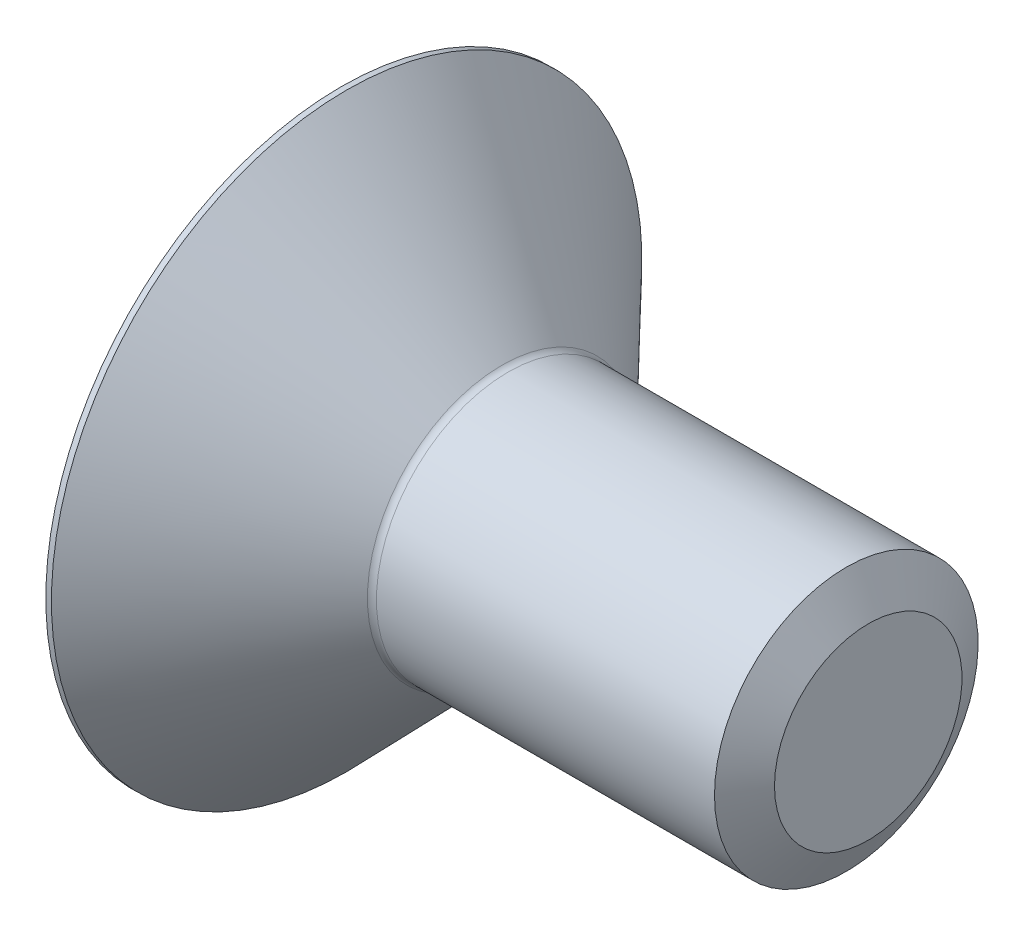
ISO-10303-21;
HEADER;
FILE_DESCRIPTION(('STEP AP214'),'2;1');
FILE_NAME('part.step','',(''),(''),'','','');
FILE_SCHEMA(('AUTOMOTIVE_DESIGN { 1 0 10303 214 1 1 1 1 }'));
ENDSEC;
DATA;
#1=APPLICATION_CONTEXT('core data for automotive mechanical design processes');
#2=APPLICATION_PROTOCOL_DEFINITION('international standard','automotive_design',2000,#1);
#3=PRODUCT_CONTEXT('',#1,'mechanical');
#4=PRODUCT('Part','Part','',(#3));
#5=PRODUCT_RELATED_PRODUCT_CATEGORY('part','',(#4));
#6=PRODUCT_DEFINITION_FORMATION('','',#4);
#7=PRODUCT_DEFINITION_CONTEXT('part definition',#1,'design');
#8=PRODUCT_DEFINITION('design','',#6,#7);
#9=PRODUCT_DEFINITION_SHAPE('','',#8);
#10=(LENGTH_UNIT() NAMED_UNIT(*) SI_UNIT(.MILLI.,.METRE.));
#11=(NAMED_UNIT(*) PLANE_ANGLE_UNIT() SI_UNIT($,.RADIAN.));
#12=(NAMED_UNIT(*) SI_UNIT($,.STERADIAN.) SOLID_ANGLE_UNIT());
#13=UNCERTAINTY_MEASURE_WITH_UNIT(LENGTH_MEASURE(1.E-05),#10,'distance_accuracy_value','');
#14=(GEOMETRIC_REPRESENTATION_CONTEXT(3) GLOBAL_UNCERTAINTY_ASSIGNED_CONTEXT((#13)) GLOBAL_UNIT_ASSIGNED_CONTEXT((#10,
#11,#12)) REPRESENTATION_CONTEXT('',''));
#15=CARTESIAN_POINT('',(0.,0.,0.));
#16=DIRECTION('',(0.,0.,1.));
#17=DIRECTION('',(1.,0.,0.));
#18=AXIS2_PLACEMENT_3D('',#15,#16,#17);
#19=CARTESIAN_POINT('',(0.,0.,0.));
#20=DIRECTION('',(1.,0.,0.));
#21=DIRECTION('',(0.,1.,0.));
#22=AXIS2_PLACEMENT_3D('',#19,#20,#21);
#23=CYLINDRICAL_SURFACE('',#22,1.5);
#24=CARTESIAN_POINT('',(-4.09755251837904,0.,0.));
#25=DIRECTION('',(1.,0.,0.));
#26=DIRECTION('',(0.,1.,0.));
#27=AXIS2_PLACEMENT_3D('',#24,#25,#26);
#28=CIRCLE('',#27,1.5);
#29=CARTESIAN_POINT('',(-4.09755251837904,1.5,0.));
#30=VERTEX_POINT('',#29);
#31=EDGE_CURVE('E102',#30,#30,#28,.T.);
#32=ORIENTED_EDGE('',*,*,#31,.T.);
#33=EDGE_LOOP('',(#32));
#34=FACE_BOUND('',#33,.T.);
#35=CARTESIAN_POINT('',(-0.25,0.,0.));
#36=DIRECTION('',(-1.,0.,0.));
#37=DIRECTION('',(0.,0.,1.));
#38=AXIS2_PLACEMENT_3D('',#35,#36,#37);
#39=CIRCLE('',#38,1.5);
#40=CARTESIAN_POINT('',(-0.25,0.,1.5));
#41=VERTEX_POINT('',#40);
#42=EDGE_CURVE('E92',#41,#41,#39,.T.);
#43=ORIENTED_EDGE('',*,*,#42,.T.);
#44=EDGE_LOOP('',(#43));
#45=FACE_BOUND('',#44,.T.);
#46=ADVANCED_FACE('F17',(#34,#45),#23,.T.);
#47=CARTESIAN_POINT('',(-6.,3.36,0.));
#48=DIRECTION('',(-1.,0.,0.));
#49=DIRECTION('',(0.,-1.,0.));
#50=AXIS2_PLACEMENT_3D('',#47,#48,#49);
#51=PLANE('',#50);
#52=CARTESIAN_POINT('',(-6.,0.,0.));
#53=DIRECTION('',(1.,0.,0.));
#54=DIRECTION('',(0.,1.,0.));
#55=AXIS2_PLACEMENT_3D('',#52,#53,#54);
#56=CIRCLE('',#55,3.36);
#57=CARTESIAN_POINT('',(-6.,3.36,0.));
#58=VERTEX_POINT('',#57);
#59=EDGE_CURVE('E198',#58,#58,#56,.T.);
#60=ORIENTED_EDGE('',*,*,#59,.F.);
#61=EDGE_LOOP('',(#60));
#62=FACE_BOUND('',#61,.T.);
#63=CARTESIAN_POINT('',(-6.,0.,0.));
#64=DIRECTION('',(-1.,0.,0.));
#65=DIRECTION('',(0.,-1.,0.));
#66=AXIS2_PLACEMENT_3D('',#63,#64,#65);
#67=CIRCLE('',#66,1.15470053837925);
#68=CARTESIAN_POINT('',(-6.,-0.577350269189629,1.));
#69=VERTEX_POINT('',#68);
#70=CARTESIAN_POINT('',(-6.,-1.15470053837925,0.));
#71=VERTEX_POINT('',#70);
#72=EDGE_CURVE('E21',#69,#71,#67,.F.);
#73=ORIENTED_EDGE('',*,*,#72,.T.);
#74=CARTESIAN_POINT('',(-6.,-0.577350269189629,-1.));
#75=VERTEX_POINT('',#74);
#76=EDGE_CURVE('E11',#71,#75,#67,.F.);
#77=ORIENTED_EDGE('',*,*,#76,.T.);
#78=CARTESIAN_POINT('',(-6.,0.577350269189625,-1.));
#79=VERTEX_POINT('',#78);
#80=EDGE_CURVE('E27',#75,#79,#67,.F.);
#81=ORIENTED_EDGE('',*,*,#80,.T.);
#82=CARTESIAN_POINT('',(-6.,1.15470053837925,0.));
#83=VERTEX_POINT('',#82);
#84=EDGE_CURVE('E93',#79,#83,#67,.F.);
#85=ORIENTED_EDGE('',*,*,#84,.T.);
#86=CARTESIAN_POINT('',(-6.,0.,0.));
#87=DIRECTION('',(-1.,0.,0.));
#88=DIRECTION('',(0.,0.,1.));
#89=AXIS2_PLACEMENT_3D('',#86,#87,#88);
#90=CIRCLE('',#89,1.15470053837925);
#91=CARTESIAN_POINT('',(-6.,0.577350269189628,1.));
#92=VERTEX_POINT('',#91);
#93=EDGE_CURVE('E76',#92,#83,#90,.T.);
#94=ORIENTED_EDGE('',*,*,#93,.F.);
#95=EDGE_CURVE('E83',#92,#69,#67,.F.);
#96=ORIENTED_EDGE('',*,*,#95,.T.);
#97=EDGE_LOOP('',(#73,#77,#81,#85,#94,#96));
#98=FACE_BOUND('',#97,.T.);
#99=ADVANCED_FACE('F95',(#62,#98),#51,.T.);
#100=CARTESIAN_POINT('',(0.,0.,0.));
#101=DIRECTION('',(1.,0.,0.));
#102=DIRECTION('',(0.,1.,0.));
#103=AXIS2_PLACEMENT_3D('',#100,#101,#102);
#104=CYLINDRICAL_SURFACE('',#103,3.36);
#105=ORIENTED_EDGE('',*,*,#59,.T.);
#106=EDGE_LOOP('',(#105));
#107=FACE_BOUND('',#106,.T.);
#108=CARTESIAN_POINT('',(-5.93618112114115,0.,0.));
#109=DIRECTION('',(1.,0.,0.));
#110=DIRECTION('',(0.,1.,0.));
#111=AXIS2_PLACEMENT_3D('',#108,#109,#110);
#112=CIRCLE('',#111,3.36);
#113=CARTESIAN_POINT('',(-5.93618112114115,3.36,0.));
#114=VERTEX_POINT('',#113);
#115=EDGE_CURVE('E196',#114,#114,#112,.T.);
#116=ORIENTED_EDGE('',*,*,#115,.F.);
#117=EDGE_LOOP('',(#116));
#118=FACE_BOUND('',#117,.T.);
#119=ADVANCED_FACE('F183',(#107,#118),#104,.T.);
#120=CARTESIAN_POINT('',(-4.1694864984129,0.,0.));
#121=DIRECTION('',(-1.,0.,0.));
#122=DIRECTION('',(0.,-1.,0.));
#123=AXIS2_PLACEMENT_3D('',#120,#121,#122);
#124=CONICAL_SURFACE('',#123,1.5305341629541,0.802851455917394);
#125=ORIENTED_EDGE('',*,*,#115,.T.);
#126=EDGE_LOOP('',(#125));
#127=FACE_BOUND('',#126,.T.);
#128=CARTESIAN_POINT('',(-4.1694864984129,0.,0.));
#129=DIRECTION('',(1.,0.,0.));
#130=DIRECTION('',(0.,1.,0.));
#131=AXIS2_PLACEMENT_3D('',#128,#129,#130);
#132=CIRCLE('',#131,1.5305341629541);
#133=CARTESIAN_POINT('',(-4.1694864984129,1.5305341629541,0.));
#134=VERTEX_POINT('',#133);
#135=EDGE_CURVE('E205',#134,#134,#132,.T.);
#136=ORIENTED_EDGE('',*,*,#135,.F.);
#137=EDGE_LOOP('',(#136));
#138=FACE_BOUND('',#137,.T.);
#139=ADVANCED_FACE('F177',(#127,#138),#124,.T.);
#140=CARTESIAN_POINT('',(-4.09755251837904,0.,0.));
#141=DIRECTION('',(1.,0.,0.));
#142=DIRECTION('',(0.,1.,0.));
#143=AXIS2_PLACEMENT_3D('',#140,#141,#142);
#144=TOROIDAL_SURFACE('',#143,1.6,0.1);
#145=ORIENTED_EDGE('',*,*,#135,.T.);
#146=EDGE_LOOP('',(#145));
#147=FACE_BOUND('',#146,.T.);
#148=ORIENTED_EDGE('',*,*,#31,.F.);
#149=EDGE_LOOP('',(#148));
#150=FACE_BOUND('',#149,.T.);
#151=ADVANCED_FACE('F175',(#147,#150),#144,.F.);
#152=CARTESIAN_POINT('',(-5.67,0.,0.));
#153=DIRECTION('',(-1.,0.,0.));
#154=DIRECTION('',(0.,0.,1.));
#155=AXIS2_PLACEMENT_3D('',#152,#153,#154);
#156=CONICAL_SURFACE('',#155,0.,1.2924281638629);
#157=CARTESIAN_POINT('',(-6.00003300494951,-0.577234799135789,1.0002));
#158=CARTESIAN_POINT('',(-5.99317677231321,-0.601209328784404,0.958674896561033));
#159=CARTESIAN_POINT('',(-5.98695024930601,-0.625233209733956,0.917064314161421));
#160=CARTESIAN_POINT('',(-5.97600820198551,-0.673377505205147,0.833675948310711));
#161=CARTESIAN_POINT('',(-5.97129338172424,-0.697497959424798,0.791898096100636));
#162=CARTESIAN_POINT('',(-5.9636556441477,-0.745669161891495,0.70846312596663));
#163=CARTESIAN_POINT('',(-5.96072237456089,-0.769719488656233,0.66680673807147));
#164=CARTESIAN_POINT('',(-5.95678895886859,-0.817855017501817,0.583433556461721));
#165=CARTESIAN_POINT('',(-5.95578838324886,-0.841940210643128,0.54171677823086));
#166=CARTESIAN_POINT('',(-5.95578838324886,-0.890110596925751,0.458283221769139));
#167=CARTESIAN_POINT('',(-5.95678895886859,-0.914195790067062,0.416566443538279));
#168=CARTESIAN_POINT('',(-5.96072237456089,-0.962331318912646,0.333193261928529));
#169=CARTESIAN_POINT('',(-5.9636556441477,-0.986381645677384,0.29153687403337));
#170=CARTESIAN_POINT('',(-5.97129338172424,-1.03455284814408,0.208101903899363));
#171=CARTESIAN_POINT('',(-5.97600820198551,-1.05867330236373,0.166324051689289));
#172=CARTESIAN_POINT('',(-5.98695024930601,-1.10681759783492,0.0829356858385784));
#173=CARTESIAN_POINT('',(-5.99317677231321,-1.13084147878448,0.0413251034389669));
#174=CARTESIAN_POINT('',(-6.00003300494951,-1.15481600843309,-0.000200000000000191));
#175=B_SPLINE_CURVE_WITH_KNOTS('',3,(#157,#158,#159,#160,#161,#162,#163,#164,#165,#166,#167,
#168,#169,#170,#171,#172,#173,#174),.UNSPECIFIED.,.F.,.F.,(4,2,2,2,2,2,2,2,4),(0.,
0.145319064827825,0.290705711767535,0.435239252261503,0.579740668498364,0.724242084735226,
0.868775625229194,1.0141622721689,1.15948133699673),.UNSPECIFIED.);
#176=EDGE_CURVE('E109',#69,#71,#175,.T.);
#177=ORIENTED_EDGE('',*,*,#176,.T.);
#178=ORIENTED_EDGE('',*,*,#72,.F.);
#179=EDGE_LOOP('',(#177,#178));
#180=FACE_BOUND('',#179,.T.);
#181=ADVANCED_FACE('F178',(#180),#156,.F.);
#182=CARTESIAN_POINT('',(-6.18642012479891,-1.50507658562174,1.));
#183=CARTESIAN_POINT('',(-6.17568053389836,-1.45995191683151,1.));
#184=CARTESIAN_POINT('',(-6.16507725550091,-1.41479478404147,1.));
#185=CARTESIAN_POINT('',(-6.14421246509078,-1.32439927872503,1.));
#186=CARTESIAN_POINT('',(-6.13395097066939,-1.27916090214299,1.));
#187=CARTESIAN_POINT('',(-6.10376110485824,-1.14320091952673,1.));
#188=CARTESIAN_POINT('',(-6.0844526928259,-1.0523395057026,1.));
#189=CARTESIAN_POINT('',(-6.0485427680109,-0.87102173365142,1.));
#190=CARTESIAN_POINT('',(-6.03191600726561,-0.780570478060275,1.));
#191=CARTESIAN_POINT('',(-6.00245938977244,-0.599053834032337,1.));
#192=CARTESIAN_POINT('',(-5.98962864404707,-0.507988594500086,1.));
#193=CARTESIAN_POINT('',(-5.96943375174607,-0.32401701013366,1.));
#194=CARTESIAN_POINT('',(-5.96214218519738,-0.231102062710143,1.));
#195=CARTESIAN_POINT('',(-5.95667782512395,-0.0915430747170623,1.));
#196=CARTESIAN_POINT('',(-5.9557682159605,-0.0450005144934814,1.));
#197=CARTESIAN_POINT('',(-5.95580922979905,0.0480838901527624,1.));
#198=CARTESIAN_POINT('',(-5.9567598571057,0.0946257345735195,1.));
#199=CARTESIAN_POINT('',(-5.96235911230975,0.234573783926051,1.));
#200=CARTESIAN_POINT('',(-5.96977149970246,0.327875024932964,1.));
#201=CARTESIAN_POINT('',(-5.9903648179936,0.513866327853432,1.));
#202=CARTESIAN_POINT('',(-6.00355054731467,0.60655581613127,1.));
#203=CARTESIAN_POINT('',(-6.03433027338348,0.7945597970276,1.));
#204=CARTESIAN_POINT('',(-6.05206417336318,0.889850634542145,1.));
#205=CARTESIAN_POINT('',(-6.09017928884159,1.07990716554416,1.));
#206=CARTESIAN_POINT('',(-6.11056098996145,1.17467275936659,1.));
#207=CARTESIAN_POINT('',(-6.15303020702755,1.36384761434311,1.));
#208=CARTESIAN_POINT('',(-6.17511824931274,1.45825675605089,1.));
#209=CARTESIAN_POINT('',(-6.22042048843016,1.64680497415505,1.));
#210=CARTESIAN_POINT('',(-6.24363471263919,1.74094404392717,1.));
#211=CARTESIAN_POINT('',(-6.29049807328423,1.92768913293957,1.));
#212=CARTESIAN_POINT('',(-6.31413631318398,2.02029789764918,1.));
#213=CARTESIAN_POINT('',(-6.36194659114886,2.20537976707471,1.));
#214=CARTESIAN_POINT('',(-6.38611864310246,2.2978528681941,1.));
#215=CARTESIAN_POINT('',(-6.43481362957481,2.48255351818147,1.));
#216=CARTESIAN_POINT('',(-6.45933596375947,2.57478122564271,1.));
#217=CARTESIAN_POINT('',(-6.50867632184139,2.75915354563859,1.));
#218=CARTESIAN_POINT('',(-6.53349433367616,2.8512981613992,1.));
#219=CARTESIAN_POINT('',(-6.55841535287488,2.94341459729474,1.));
#220=B_SPLINE_CURVE_WITH_KNOTS('',3,(#182,#183,#184,#185,#186,#187,#188,#189,#190,#191,#192,
#193,#194,#195,#196,#197,#198,#199,#200,#201,#202,#203,#204,#205,#206,#207,#208,#209,#210,#211,
#212,#213,#214,#215,#216,#217,#218,#219),.UNSPECIFIED.,.F.,.F.,(4,2,2,2,2,2,2,2,2,2,2,2,2,2,2,2,
2,2,4),(0.,0.139154753232828,0.278316657587893,0.556964604480122,0.832812881766321,
1.10859650773445,1.38793420964474,1.52755398880046,1.66717409104072,1.94769382621528,
2.22844715485888,2.51916941430301,2.80994506926728,3.10081077796332,3.39168356097395,
3.67841536084619,3.96515462957442,4.25145053495921,4.53773480030589),.UNSPECIFIED.);
#221=EDGE_CURVE('E82',#92,#69,#220,.F.);
#222=ORIENTED_EDGE('',*,*,#221,.T.);
#223=ORIENTED_EDGE('',*,*,#95,.F.);
#224=EDGE_LOOP('',(#222,#223));
#225=FACE_BOUND('',#224,.T.);
#226=ADVANCED_FACE('F88',(#225),#156,.F.);
#227=CARTESIAN_POINT('',(-6.00003300494951,1.15481600843309,-0.000199999999999794));
#228=CARTESIAN_POINT('',(-5.99317677231321,1.13084147878447,0.0413251034389668));
#229=CARTESIAN_POINT('',(-5.986950249306,1.10681759783492,0.082935685838578));
#230=CARTESIAN_POINT('',(-5.97600820198551,1.05867330236373,0.166324051689289));
#231=CARTESIAN_POINT('',(-5.97129338172424,1.03455284814408,0.208101903899363));
#232=CARTESIAN_POINT('',(-5.9636556441477,0.986381645677383,0.291536874033369));
#233=CARTESIAN_POINT('',(-5.96072237456089,0.962331318912645,0.333193261928529));
#234=CARTESIAN_POINT('',(-5.95678895886859,0.91419579006706,0.416566443538279));
#235=CARTESIAN_POINT('',(-5.95578838324886,0.890110596925749,0.458283221769139));
#236=CARTESIAN_POINT('',(-5.95578838324886,0.841940210643127,0.54171677823086));
#237=CARTESIAN_POINT('',(-5.95678895886859,0.817855017501815,0.58343355646172));
#238=CARTESIAN_POINT('',(-5.96072237456089,0.769719488656231,0.66680673807147));
#239=CARTESIAN_POINT('',(-5.9636556441477,0.745669161891493,0.70846312596663));
#240=CARTESIAN_POINT('',(-5.97129338172424,0.697497959424796,0.791898096100636));
#241=CARTESIAN_POINT('',(-5.97600820198551,0.673377505205145,0.833675948310711));
#242=CARTESIAN_POINT('',(-5.986950249306,0.625233209733954,0.917064314161421));
#243=CARTESIAN_POINT('',(-5.99317677231321,0.601209328784401,0.958674896561033));
#244=CARTESIAN_POINT('',(-6.00003300494951,0.577234799135787,1.0002));
#245=B_SPLINE_CURVE_WITH_KNOTS('',3,(#227,#228,#229,#230,#231,#232,#233,#234,#235,#236,#237,
#238,#239,#240,#241,#242,#243,#244),.UNSPECIFIED.,.F.,.F.,(4,2,2,2,2,2,2,2,4),(0.,
0.145319064827825,0.290705711767535,0.435239252261503,0.579740668498365,0.724242084735226,
0.868775625229194,1.0141622721689,1.15948133699673),.UNSPECIFIED.);
#246=EDGE_CURVE('E71',#83,#92,#245,.T.);
#247=ORIENTED_EDGE('',*,*,#246,.T.);
#248=ORIENTED_EDGE('',*,*,#93,.T.);
#249=EDGE_LOOP('',(#247,#248));
#250=FACE_BOUND('',#249,.T.);
#251=ADVANCED_FACE('F72',(#250),#156,.F.);
#252=CARTESIAN_POINT('',(-6.00003300494951,0.577234799135787,-1.0002));
#253=CARTESIAN_POINT('',(-5.99317677231321,0.601209328784401,-0.958674896561033));
#254=CARTESIAN_POINT('',(-5.986950249306,0.625233209733954,-0.917064314161421));
#255=CARTESIAN_POINT('',(-5.97600820198551,0.673377505205145,-0.83367594831071));
#256=CARTESIAN_POINT('',(-5.97129338172424,0.697497959424796,-0.791898096100636));
#257=CARTESIAN_POINT('',(-5.9636556441477,0.745669161891493,-0.70846312596663));
#258=CARTESIAN_POINT('',(-5.96072237456089,0.769719488656231,-0.66680673807147));
#259=CARTESIAN_POINT('',(-5.95678895886859,0.817855017501815,-0.58343355646172));
#260=CARTESIAN_POINT('',(-5.95578838324886,0.841940210643126,-0.54171677823086));
#261=CARTESIAN_POINT('',(-5.95578838324886,0.890110596925749,-0.458283221769139));
#262=CARTESIAN_POINT('',(-5.95678895886859,0.91419579006706,-0.416566443538278));
#263=CARTESIAN_POINT('',(-5.96072237456089,0.962331318912644,-0.333193261928529));
#264=CARTESIAN_POINT('',(-5.9636556441477,0.986381645677382,-0.291536874033369));
#265=CARTESIAN_POINT('',(-5.97129338172424,1.03455284814408,-0.208101903899362));
#266=CARTESIAN_POINT('',(-5.97600820198551,1.05867330236373,-0.166324051689288));
#267=CARTESIAN_POINT('',(-5.986950249306,1.10681759783492,-0.0829356858385774));
#268=CARTESIAN_POINT('',(-5.99317677231321,1.13084147878447,-0.0413251034389662));
#269=CARTESIAN_POINT('',(-6.00003300494951,1.15481600843309,0.000200000000000398));
#270=B_SPLINE_CURVE_WITH_KNOTS('',3,(#252,#253,#254,#255,#256,#257,#258,#259,#260,#261,#262,
#263,#264,#265,#266,#267,#268,#269),.UNSPECIFIED.,.F.,.F.,(4,2,2,2,2,2,2,2,4),(0.,
0.145319064827825,0.290705711767535,0.435239252261503,0.579740668498365,0.724242084735227,
0.868775625229195,1.0141622721689,1.15948133699673),.UNSPECIFIED.);
#271=EDGE_CURVE('E94',#79,#83,#270,.T.);
#272=ORIENTED_EDGE('',*,*,#271,.T.);
#273=ORIENTED_EDGE('',*,*,#84,.F.);
#274=EDGE_LOOP('',(#272,#273));
#275=FACE_BOUND('',#274,.T.);
#276=ADVANCED_FACE('F276',(#275),#156,.F.);
#277=CARTESIAN_POINT('',(-6.18642012479891,-1.50507658562174,-1.));
#278=CARTESIAN_POINT('',(-6.17568053389836,-1.45995191683151,-1.));
#279=CARTESIAN_POINT('',(-6.16507725550091,-1.41479478404147,-1.));
#280=CARTESIAN_POINT('',(-6.14421246509078,-1.32439927872503,-1.));
#281=CARTESIAN_POINT('',(-6.13395097066939,-1.27916090214299,-1.));
#282=CARTESIAN_POINT('',(-6.10376110485824,-1.14320091952673,-1.));
#283=CARTESIAN_POINT('',(-6.0844526928259,-1.0523395057026,-1.));
#284=CARTESIAN_POINT('',(-6.0485427680109,-0.87102173365142,-1.));
#285=CARTESIAN_POINT('',(-6.03191600726561,-0.780570478060275,-1.));
#286=CARTESIAN_POINT('',(-6.00245938977244,-0.599053834032337,-1.));
#287=CARTESIAN_POINT('',(-5.98962864404707,-0.507988594500086,-1.));
#288=CARTESIAN_POINT('',(-5.96943375174607,-0.32401701013366,-1.));
#289=CARTESIAN_POINT('',(-5.96214218519738,-0.231102062710143,-1.));
#290=CARTESIAN_POINT('',(-5.95667782512395,-0.0915430747170623,-1.));
#291=CARTESIAN_POINT('',(-5.9557682159605,-0.0450005144934814,-1.));
#292=CARTESIAN_POINT('',(-5.95580922979905,0.0480838901527624,-1.));
#293=CARTESIAN_POINT('',(-5.9567598571057,0.0946257345735195,-1.));
#294=CARTESIAN_POINT('',(-5.96235911230975,0.234573783926051,-1.));
#295=CARTESIAN_POINT('',(-5.96977149970246,0.327875024932964,-1.));
#296=CARTESIAN_POINT('',(-5.9903648179936,0.513866327853432,-1.));
#297=CARTESIAN_POINT('',(-6.00355054731467,0.60655581613127,-1.));
#298=CARTESIAN_POINT('',(-6.03433027338348,0.7945597970276,-1.));
#299=CARTESIAN_POINT('',(-6.05206417336318,0.889850634542145,-1.));
#300=CARTESIAN_POINT('',(-6.09017928884159,1.07990716554416,-1.));
#301=CARTESIAN_POINT('',(-6.11056098996145,1.17467275936659,-1.));
#302=CARTESIAN_POINT('',(-6.15303020702755,1.36384761434311,-1.));
#303=CARTESIAN_POINT('',(-6.17511824931274,1.45825675605089,-1.));
#304=CARTESIAN_POINT('',(-6.22042048843016,1.64680497415505,-1.));
#305=CARTESIAN_POINT('',(-6.24363471263919,1.74094404392717,-1.));
#306=CARTESIAN_POINT('',(-6.29049807328423,1.92768913293957,-1.));
#307=CARTESIAN_POINT('',(-6.31413631318398,2.02029789764918,-1.));
#308=CARTESIAN_POINT('',(-6.36194659114886,2.20537976707471,-1.));
#309=CARTESIAN_POINT('',(-6.38611864310246,2.2978528681941,-1.));
#310=CARTESIAN_POINT('',(-6.43481362957481,2.48255351818147,-1.));
#311=CARTESIAN_POINT('',(-6.45933596375947,2.57478122564271,-1.));
#312=CARTESIAN_POINT('',(-6.50867632184139,2.75915354563859,-1.));
#313=CARTESIAN_POINT('',(-6.53349433367616,2.8512981613992,-1.));
#314=CARTESIAN_POINT('',(-6.55841535287488,2.94341459729474,-1.));
#315=B_SPLINE_CURVE_WITH_KNOTS('',3,(#277,#278,#279,#280,#281,#282,#283,#284,#285,#286,#287,
#288,#289,#290,#291,#292,#293,#294,#295,#296,#297,#298,#299,#300,#301,#302,#303,#304,#305,#306,
#307,#308,#309,#310,#311,#312,#313,#314),.UNSPECIFIED.,.F.,.F.,(4,2,2,2,2,2,2,2,2,2,2,2,2,2,2,2,
2,2,4),(0.,0.139154753232828,0.278316657587893,0.556964604480122,0.832812881766321,
1.10859650773445,1.38793420964474,1.52755398880046,1.66717409104072,1.94769382621528,
2.22844715485888,2.51916941430301,2.80994506926728,3.10081077796332,3.39168356097395,
3.67841536084619,3.96515462957442,4.25145053495921,4.53773480030589),.UNSPECIFIED.);
#316=EDGE_CURVE('E235',#75,#79,#315,.T.);
#317=ORIENTED_EDGE('',*,*,#316,.T.);
#318=ORIENTED_EDGE('',*,*,#80,.F.);
#319=EDGE_LOOP('',(#317,#318));
#320=FACE_BOUND('',#319,.T.);
#321=ADVANCED_FACE('F262',(#320),#156,.F.);
#322=CARTESIAN_POINT('',(-6.00003300494951,-1.15481600843309,0.000199999999999855));
#323=CARTESIAN_POINT('',(-5.99317677231321,-1.13084147878448,-0.0413251034389674));
#324=CARTESIAN_POINT('',(-5.98695024930601,-1.10681759783492,-0.0829356858385789));
#325=CARTESIAN_POINT('',(-5.97600820198551,-1.05867330236373,-0.166324051689289));
#326=CARTESIAN_POINT('',(-5.97129338172424,-1.03455284814408,-0.208101903899364));
#327=CARTESIAN_POINT('',(-5.9636556441477,-0.986381645677384,-0.29153687403337));
#328=CARTESIAN_POINT('',(-5.96072237456089,-0.962331318912646,-0.33319326192853));
#329=CARTESIAN_POINT('',(-5.95678895886859,-0.914195790067062,-0.416566443538279));
#330=CARTESIAN_POINT('',(-5.95578838324886,-0.890110596925751,-0.45828322176914));
#331=CARTESIAN_POINT('',(-5.95578838324886,-0.841940210643128,-0.54171677823086));
#332=CARTESIAN_POINT('',(-5.95678895886859,-0.817855017501817,-0.583433556461721));
#333=CARTESIAN_POINT('',(-5.96072237456089,-0.769719488656233,-0.66680673807147));
#334=CARTESIAN_POINT('',(-5.9636556441477,-0.745669161891495,-0.70846312596663));
#335=CARTESIAN_POINT('',(-5.97129338172424,-0.697497959424798,-0.791898096100636));
#336=CARTESIAN_POINT('',(-5.97600820198551,-0.673377505205147,-0.833675948310711));
#337=CARTESIAN_POINT('',(-5.986950249306,-0.625233209733956,-0.917064314161421));
#338=CARTESIAN_POINT('',(-5.99317677231321,-0.601209328784403,-0.958674896561033));
#339=CARTESIAN_POINT('',(-6.00003300494951,-0.577234799135789,-1.0002));
#340=B_SPLINE_CURVE_WITH_KNOTS('',3,(#322,#323,#324,#325,#326,#327,#328,#329,#330,#331,#332,
#333,#334,#335,#336,#337,#338,#339),.UNSPECIFIED.,.F.,.F.,(4,2,2,2,2,2,2,2,4),(0.,
0.145319064827825,0.290705711767535,0.435239252261503,0.579740668498364,0.724242084735226,
0.868775625229194,1.0141622721689,1.15948133699673),.UNSPECIFIED.);
#341=EDGE_CURVE('E115',#71,#75,#340,.T.);
#342=ORIENTED_EDGE('',*,*,#341,.T.);
#343=ORIENTED_EDGE('',*,*,#76,.F.);
#344=EDGE_LOOP('',(#342,#343));
#345=FACE_BOUND('',#344,.T.);
#346=ADVANCED_FACE('F270',(#345),#156,.F.);
#347=CARTESIAN_POINT('',(-4.9,0.,0.));
#348=DIRECTION('',(-1.,0.,0.));
#349=DIRECTION('',(0.,0.,1.));
#350=AXIS2_PLACEMENT_3D('',#347,#348,#349);
#351=CONICAL_SURFACE('',#350,1.15470053837925,1.0471975511966);
#352=CARTESIAN_POINT('',(-4.23333333333334,0.,0.));
#353=VERTEX_POINT('',#352);
#354=VERTEX_LOOP('',#353);
#355=FACE_BOUND('',#354,.T.);
#356=CARTESIAN_POINT('',(-5.27183528873947,-1.49514512143374,1.));
#357=CARTESIAN_POINT('',(-5.25111502079343,-1.4519612611533,1.));
#358=CARTESIAN_POINT('',(-5.23061367234947,-1.40867282404236,1.));
#359=CARTESIAN_POINT('',(-5.1901634335246,-1.32182947914248,1.));
#360=CARTESIAN_POINT('',(-5.17021464256729,-1.27827452509756,1.));
#361=CARTESIAN_POINT('',(-5.11114515483649,-1.14662339890625,1.));
#362=CARTESIAN_POINT('',(-5.07305252653304,-1.05805724149108,1.));
#363=CARTESIAN_POINT('',(-5.00024582070058,-0.876833003172498,1.));
#364=CARTESIAN_POINT('',(-4.96564584045392,-0.784128452056497,1.));
#365=CARTESIAN_POINT('',(-4.90407347381845,-0.596331746532131,1.));
#366=CARTESIAN_POINT('',(-4.87708128484786,-0.501246505541256,1.));
#367=CARTESIAN_POINT('',(-4.84577577003502,-0.356699986452703,1.));
#368=CARTESIAN_POINT('',(-4.83687509854699,-0.308244163171709,1.));
#369=CARTESIAN_POINT('',(-4.82274243175691,-0.210788870695443,1.));
#370=CARTESIAN_POINT('',(-4.81751018853518,-0.161789438465743,1.));
#371=CARTESIAN_POINT('',(-4.81119898098177,-0.0641060489970664,1.));
#372=CARTESIAN_POINT('',(-4.8100710050111,-0.0154253461269773,1.));
#373=CARTESIAN_POINT('',(-4.81193297830514,0.0818553564032751,1.));
#374=CARTESIAN_POINT('',(-4.81492318255361,0.130455350879702,1.));
#375=CARTESIAN_POINT('',(-4.82711832172931,0.250369589613778,1.));
#376=CARTESIAN_POINT('',(-4.83860856098489,0.321451919115028,1.));
#377=CARTESIAN_POINT('',(-4.86824031739763,0.462229038490169,1.));
#378=CARTESIAN_POINT('',(-4.88638985094493,0.531922048861734,1.));
#379=CARTESIAN_POINT('',(-4.92786972268665,0.671415729806807,1.));
#380=CARTESIAN_POINT('',(-4.95130716830693,0.741183729418072,1.));
#381=CARTESIAN_POINT('',(-5.00156448824641,0.879438319396291,1.));
#382=CARTESIAN_POINT('',(-5.02838317523047,0.947925349932563,1.));
#383=CARTESIAN_POINT('',(-5.1000539154734,1.12214515906645,1.));
#384=CARTESIAN_POINT('',(-5.14657230519899,1.22718574040678,1.));
#385=CARTESIAN_POINT('',(-5.24287692224798,1.43575968104558,1.));
#386=CARTESIAN_POINT('',(-5.29266398782224,1.53929264533348,1.));
#387=CARTESIAN_POINT('',(-5.39433644453464,1.74546702338822,1.));
#388=CARTESIAN_POINT('',(-5.44622418186697,1.84810727553999,1.));
#389=CARTESIAN_POINT('',(-5.55133836883522,2.05270058021726,1.));
#390=CARTESIAN_POINT('',(-5.60456486267233,2.15465360991173,1.));
#391=CARTESIAN_POINT('',(-5.7068669169112,2.34846553091283,1.));
#392=CARTESIAN_POINT('',(-5.75585965896404,2.44036823161571,1.));
#393=CARTESIAN_POINT('',(-5.85440313282821,2.623877990053,1.));
#394=CARTESIAN_POINT('',(-5.90395388528949,2.71548503668387,1.));
#395=CARTESIAN_POINT('',(-6.00334710767982,2.89823865557593,1.));
#396=CARTESIAN_POINT('',(-6.05318851504101,2.98938580641155,1.));
#397=CARTESIAN_POINT('',(-6.15319572337612,3.17149583112621,1.));
#398=CARTESIAN_POINT('',(-6.20336150723715,3.26245871439935,1.));
#399=CARTESIAN_POINT('',(-6.25364621220496,3.35335539208175,1.));
#400=B_SPLINE_CURVE_WITH_KNOTS('',3,(#356,#357,#358,#359,#360,#361,#362,#363,#364,#365,#366,
#367,#368,#369,#370,#371,#372,#373,#374,#375,#376,#377,#378,#379,#380,#381,#382,#383,#384,#385,
#386,#387,#388,#389,#390,#391,#392,#393,#394,#395,#396,#397,#398,#399),.UNSPECIFIED.,.F.,.F.,(4,
2,2,2,2,2,2,2,2,2,2,2,2,2,2,2,2,2,2,2,2,4),(0.,0.14369034182065,0.287406372566274,
0.576560332877491,0.873259488934031,1.16917907000006,1.31686338831957,1.46453772487642,
1.61044269221659,1.75635669390452,1.97192533331898,2.18775432802313,2.40842600301165,
2.62902040304935,2.97355048126458,3.31816926186284,3.66318417395131,4.00821049225242,
4.32064609598596,4.63309330006988,4.94474578248761,5.2563819552864),.UNSPECIFIED.);
#401=CARTESIAN_POINT('',(-4.9,-0.577350269189627,1.));
#402=VERTEX_POINT('',#401);
#403=CARTESIAN_POINT('',(-4.9,0.577350269189625,1.));
#404=VERTEX_POINT('',#403);
#405=EDGE_CURVE('E145',#402,#404,#400,.T.);
#406=ORIENTED_EDGE('',*,*,#405,.T.);
#407=CARTESIAN_POINT('',(-4.90006667666567,0.577234799135787,1.0002));
#408=CARTESIAN_POINT('',(-4.88540897364915,0.602607795820546,0.95625268060172));
#409=CARTESIAN_POINT('',(-4.8720777236209,0.628199807531656,0.91192601605018));
#410=CARTESIAN_POINT('',(-4.84880650762345,0.67982709833083,0.822504925328878));
#411=CARTESIAN_POINT('',(-4.83887477654978,0.705863295614157,0.777408908798269));
#412=CARTESIAN_POINT('',(-4.82341269488208,0.757612978088366,0.687775829477381));
#413=CARTESIAN_POINT('',(-4.81777946809895,0.783318495222182,0.643252567766781));
#414=CARTESIAN_POINT('',(-4.81105128864025,0.83485064837367,0.553996260284983));
#415=CARTESIAN_POINT('',(-4.80995076792166,0.86067709674978,0.509263539518506));
#416=CARTESIAN_POINT('',(-4.81222505229814,0.908946264126689,0.425658889182654));
#417=CARTESIAN_POINT('',(-4.81504143886341,0.931396163287556,0.386774523211234));
#418=CARTESIAN_POINT('',(-4.82397245021735,0.976149681982092,0.309259155014813));
#419=CARTESIAN_POINT('',(-4.8300901337543,0.99845314641145,0.270628421438361));
#420=CARTESIAN_POINT('',(-4.84538572572582,1.04329913914046,0.192952883515855));
#421=CARTESIAN_POINT('',(-4.85462855216896,1.0658359836813,0.153917923728832));
#422=CARTESIAN_POINT('',(-4.87560684575553,1.11057330008463,0.0764306187239872));
#423=CARTESIAN_POINT('',(-4.88733737513366,1.13277434629517,0.0379772787061402));
#424=CARTESIAN_POINT('',(-4.90006667666567,1.15481600843309,-0.000199999999999795));
#425=B_SPLINE_CURVE_WITH_KNOTS('',3,(#407,#408,#409,#410,#411,#412,#413,#414,#415,#416,#417,
#418,#419,#420,#421,#422,#423,#424),.UNSPECIFIED.,.F.,.F.,(4,2,2,2,2,2,2,2,4),(0.,
0.158523820030116,0.317428970089343,0.472400167924634,0.627180939971649,0.762016584872712,
0.896977373984234,1.03493410168667,1.17261952416172),.UNSPECIFIED.);
#426=CARTESIAN_POINT('',(-4.9,1.15470053837925,0.));
#427=VERTEX_POINT('',#426);
#428=EDGE_CURVE('E101',#404,#427,#425,.T.);
#429=ORIENTED_EDGE('',*,*,#428,.T.);
#430=CARTESIAN_POINT('',(-4.90006667666567,1.15481600843309,0.000200000000000205));
#431=CARTESIAN_POINT('',(-4.88540897364915,1.12944301174833,-0.0437473193982788));
#432=CARTESIAN_POINT('',(-4.8720777236209,1.10385100003722,-0.0880739839498189));
#433=CARTESIAN_POINT('',(-4.84880650762345,1.05222370923805,-0.17749507467112));
#434=CARTESIAN_POINT('',(-4.83887477654978,1.02618751195472,-0.22259109120173));
#435=CARTESIAN_POINT('',(-4.82341269488208,0.974437829480509,-0.312224170522617));
#436=CARTESIAN_POINT('',(-4.81777946809895,0.948732312346694,-0.356747432233218));
#437=CARTESIAN_POINT('',(-4.81105128864025,0.897200159195206,-0.446003739715016));
#438=CARTESIAN_POINT('',(-4.80995076792166,0.871373710819097,-0.490736460481493));
#439=CARTESIAN_POINT('',(-4.81222505229814,0.823104543442188,-0.574341110817345));
#440=CARTESIAN_POINT('',(-4.81504143886341,0.80065464428132,-0.613225476788765));
#441=CARTESIAN_POINT('',(-4.82397245021735,0.755901125586783,-0.690740844985185));
#442=CARTESIAN_POINT('',(-4.8300901337543,0.733597661157426,-0.729371578561638));
#443=CARTESIAN_POINT('',(-4.84538572572582,0.688751668428418,-0.807047116484145));
#444=CARTESIAN_POINT('',(-4.85462855216896,0.666214823887574,-0.846082076271167));
#445=CARTESIAN_POINT('',(-4.87560684575553,0.621477507484248,-0.923569381276012));
#446=CARTESIAN_POINT('',(-4.88733737513367,0.599276461273704,-0.962022721293859));
#447=CARTESIAN_POINT('',(-4.90006667666567,0.577234799135787,-1.0002));
#448=B_SPLINE_CURVE_WITH_KNOTS('',3,(#430,#431,#432,#433,#434,#435,#436,#437,#438,#439,#440,
#441,#442,#443,#444,#445,#446,#447),.UNSPECIFIED.,.F.,.F.,(4,2,2,2,2,2,2,2,4),(0.,
0.158523820030116,0.317428970089343,0.472400167924634,0.627180939971648,0.762016584872712,
0.896977373984234,1.03493410168667,1.17261952416172),.UNSPECIFIED.);
#449=CARTESIAN_POINT('',(-4.9,0.577350269189626,-1.));
#450=VERTEX_POINT('',#449);
#451=EDGE_CURVE('E197',#427,#450,#448,.T.);
#452=ORIENTED_EDGE('',*,*,#451,.T.);
#453=CARTESIAN_POINT('',(-5.27183528873947,-1.49514512143374,-1.));
#454=CARTESIAN_POINT('',(-5.25111502079343,-1.4519612611533,-1.));
#455=CARTESIAN_POINT('',(-5.23061367234947,-1.40867282404236,-1.));
#456=CARTESIAN_POINT('',(-5.1901634335246,-1.32182947914248,-1.));
#457=CARTESIAN_POINT('',(-5.17021464256729,-1.27827452509756,-1.));
#458=CARTESIAN_POINT('',(-5.11114515483649,-1.14662339890625,-1.));
#459=CARTESIAN_POINT('',(-5.07305252653304,-1.05805724149108,-1.));
#460=CARTESIAN_POINT('',(-5.00024582070058,-0.876833003172498,-1.));
#461=CARTESIAN_POINT('',(-4.96564584045392,-0.784128452056497,-1.));
#462=CARTESIAN_POINT('',(-4.90407347381845,-0.596331746532131,-1.));
#463=CARTESIAN_POINT('',(-4.87708128484786,-0.501246505541256,-1.));
#464=CARTESIAN_POINT('',(-4.84577577003502,-0.356699986452703,-1.));
#465=CARTESIAN_POINT('',(-4.83687509854699,-0.308244163171709,-1.));
#466=CARTESIAN_POINT('',(-4.82274243175691,-0.210788870695443,-1.));
#467=CARTESIAN_POINT('',(-4.81751018853518,-0.161789438465743,-1.));
#468=CARTESIAN_POINT('',(-4.81119898098177,-0.0641060489970664,-1.));
#469=CARTESIAN_POINT('',(-4.8100710050111,-0.0154253461269773,-1.));
#470=CARTESIAN_POINT('',(-4.81193297830514,0.0818553564032751,-1.));
#471=CARTESIAN_POINT('',(-4.81492318255361,0.130455350879702,-1.));
#472=CARTESIAN_POINT('',(-4.82711832172931,0.250369589613778,-1.));
#473=CARTESIAN_POINT('',(-4.83860856098489,0.321451919115028,-1.));
#474=CARTESIAN_POINT('',(-4.86824031739763,0.462229038490169,-1.));
#475=CARTESIAN_POINT('',(-4.88638985094493,0.531922048861734,-1.));
#476=CARTESIAN_POINT('',(-4.92786972268665,0.671415729806807,-1.));
#477=CARTESIAN_POINT('',(-4.95130716830693,0.741183729418072,-1.));
#478=CARTESIAN_POINT('',(-5.00156448824641,0.879438319396291,-1.));
#479=CARTESIAN_POINT('',(-5.02838317523047,0.947925349932563,-1.));
#480=CARTESIAN_POINT('',(-5.1000539154734,1.12214515906645,-1.));
#481=CARTESIAN_POINT('',(-5.14657230519899,1.22718574040678,-1.));
#482=CARTESIAN_POINT('',(-5.24287692224798,1.43575968104558,-1.));
#483=CARTESIAN_POINT('',(-5.29266398782224,1.53929264533348,-1.));
#484=CARTESIAN_POINT('',(-5.39433644453464,1.74546702338822,-1.));
#485=CARTESIAN_POINT('',(-5.44622418186697,1.84810727553999,-1.));
#486=CARTESIAN_POINT('',(-5.55133836883522,2.05270058021726,-1.));
#487=CARTESIAN_POINT('',(-5.60456486267233,2.15465360991173,-1.));
#488=CARTESIAN_POINT('',(-5.7068669169112,2.34846553091283,-1.));
#489=CARTESIAN_POINT('',(-5.75585965896404,2.44036823161571,-1.));
#490=CARTESIAN_POINT('',(-5.85440313282821,2.623877990053,-1.));
#491=CARTESIAN_POINT('',(-5.90395388528949,2.71548503668387,-1.));
#492=CARTESIAN_POINT('',(-6.00334710767982,2.89823865557593,-1.));
#493=CARTESIAN_POINT('',(-6.05318851504101,2.98938580641155,-1.));
#494=CARTESIAN_POINT('',(-6.15319572337612,3.17149583112621,-1.));
#495=CARTESIAN_POINT('',(-6.20336150723715,3.26245871439935,-1.));
#496=CARTESIAN_POINT('',(-6.25364621220496,3.35335539208175,-1.));
#497=B_SPLINE_CURVE_WITH_KNOTS('',3,(#453,#454,#455,#456,#457,#458,#459,#460,#461,#462,#463,
#464,#465,#466,#467,#468,#469,#470,#471,#472,#473,#474,#475,#476,#477,#478,#479,#480,#481,#482,
#483,#484,#485,#486,#487,#488,#489,#490,#491,#492,#493,#494,#495,#496),.UNSPECIFIED.,.F.,.F.,(4,
2,2,2,2,2,2,2,2,2,2,2,2,2,2,2,2,2,2,2,2,4),(0.,0.14369034182065,0.287406372566274,
0.576560332877491,0.873259488934031,1.16917907000006,1.31686338831957,1.46453772487642,
1.61044269221659,1.75635669390452,1.97192533331898,2.18775432802313,2.40842600301165,
2.62902040304935,2.97355048126458,3.31816926186284,3.66318417395131,4.00821049225242,
4.32064609598596,4.63309330006988,4.94474578248761,5.2563819552864),.UNSPECIFIED.);
#498=CARTESIAN_POINT('',(-4.9,-0.577350269189626,-1.));
#499=VERTEX_POINT('',#498);
#500=EDGE_CURVE('E79',#450,#499,#497,.F.);
#501=ORIENTED_EDGE('',*,*,#500,.T.);
#502=CARTESIAN_POINT('',(-4.90006667666567,-0.577234799135789,-1.0002));
#503=CARTESIAN_POINT('',(-4.88540897364915,-0.602607795820548,-0.95625268060172));
#504=CARTESIAN_POINT('',(-4.8720777236209,-0.628199807531658,-0.91192601605018));
#505=CARTESIAN_POINT('',(-4.84880650762346,-0.679827098330831,-0.822504925328878));
#506=CARTESIAN_POINT('',(-4.83887477654978,-0.705863295614158,-0.777408908798269));
#507=CARTESIAN_POINT('',(-4.82341269488208,-0.757612978088368,-0.687775829477381));
#508=CARTESIAN_POINT('',(-4.81777946809895,-0.783318495222183,-0.64325256776678));
#509=CARTESIAN_POINT('',(-4.81105128864025,-0.834850648373671,-0.553996260284983));
#510=CARTESIAN_POINT('',(-4.80995076792166,-0.860677096749781,-0.509263539518506));
#511=CARTESIAN_POINT('',(-4.81222505229814,-0.90894626412669,-0.425658889182654));
#512=CARTESIAN_POINT('',(-4.81504143886341,-0.931396163287557,-0.386774523211234));
#513=CARTESIAN_POINT('',(-4.82397245021735,-0.976149681982093,-0.309259155014814));
#514=CARTESIAN_POINT('',(-4.8300901337543,-0.998453146411451,-0.270628421438361));
#515=CARTESIAN_POINT('',(-4.84538572572582,-1.04329913914046,-0.192952883515855));
#516=CARTESIAN_POINT('',(-4.85462855216896,-1.0658359836813,-0.153917923728832));
#517=CARTESIAN_POINT('',(-4.87560684575553,-1.11057330008463,-0.0764306187239878));
#518=CARTESIAN_POINT('',(-4.88733737513367,-1.13277434629517,-0.0379772787061408));
#519=CARTESIAN_POINT('',(-4.90006667666567,-1.15481600843309,0.00019999999999979));
#520=B_SPLINE_CURVE_WITH_KNOTS('',3,(#502,#503,#504,#505,#506,#507,#508,#509,#510,#511,#512,
#513,#514,#515,#516,#517,#518,#519),.UNSPECIFIED.,.F.,.F.,(4,2,2,2,2,2,2,2,4),(0.,
0.158523820030115,0.317428970089343,0.472400167924634,0.627180939971648,0.762016584872711,
0.896977373984233,1.03493410168667,1.17261952416172),.UNSPECIFIED.);
#521=CARTESIAN_POINT('',(-4.9,-1.15470053837925,0.));
#522=VERTEX_POINT('',#521);
#523=EDGE_CURVE('E246',#499,#522,#520,.T.);
#524=ORIENTED_EDGE('',*,*,#523,.T.);
#525=CARTESIAN_POINT('',(-4.90006667666567,-1.15481600843309,-0.000200000000000144));
#526=CARTESIAN_POINT('',(-4.88540897364915,-1.12944301174833,0.0437473193982797));
#527=CARTESIAN_POINT('',(-4.8720777236209,-1.10385100003722,0.0880739839498199));
#528=CARTESIAN_POINT('',(-4.84880650762346,-1.05222370923805,0.177495074671121));
#529=CARTESIAN_POINT('',(-4.83887477654978,-1.02618751195472,0.222591091201731));
#530=CARTESIAN_POINT('',(-4.82341269488208,-0.97443782948051,0.312224170522618));
#531=CARTESIAN_POINT('',(-4.81777946809895,-0.948732312346695,0.356747432233219));
#532=CARTESIAN_POINT('',(-4.81105128864025,-0.897200159195207,0.446003739715017));
#533=CARTESIAN_POINT('',(-4.80995076792166,-0.871373710819098,0.490736460481494));
#534=CARTESIAN_POINT('',(-4.81222505229814,-0.823104543442189,0.574341110817346));
#535=CARTESIAN_POINT('',(-4.81504143886341,-0.800654644281322,0.613225476788766));
#536=CARTESIAN_POINT('',(-4.82397245021735,-0.755901125586786,0.690740844985186));
#537=CARTESIAN_POINT('',(-4.8300901337543,-0.733597661157428,0.729371578561639));
#538=CARTESIAN_POINT('',(-4.84538572572582,-0.68875166842842,0.807047116484145));
#539=CARTESIAN_POINT('',(-4.85462855216896,-0.666214823887576,0.846082076271168));
#540=CARTESIAN_POINT('',(-4.87560684575553,-0.621477507484251,0.923569381276012));
#541=CARTESIAN_POINT('',(-4.88733737513367,-0.599276461273706,0.962022721293859));
#542=CARTESIAN_POINT('',(-4.90006667666567,-0.577234799135789,1.0002));
#543=B_SPLINE_CURVE_WITH_KNOTS('',3,(#525,#526,#527,#528,#529,#530,#531,#532,#533,#534,#535,
#536,#537,#538,#539,#540,#541,#542),.UNSPECIFIED.,.F.,.F.,(4,2,2,2,2,2,2,2,4),(0.,
0.158523820030115,0.317428970089343,0.472400167924634,0.627180939971648,0.762016584872711,
0.896977373984233,1.03493410168667,1.17261952416172),.UNSPECIFIED.);
#544=EDGE_CURVE('E151',#522,#402,#543,.T.);
#545=ORIENTED_EDGE('',*,*,#544,.T.);
#546=EDGE_LOOP('',(#406,#429,#452,#501,#524,#545));
#547=FACE_BOUND('',#546,.T.);
#548=ADVANCED_FACE('F139',(#355,#547),#351,.F.);
#549=CARTESIAN_POINT('',(-4.04,1.15470053837925,0.));
#550=DIRECTION('',(0.,0.866025403784439,-0.5));
#551=DIRECTION('',(0.,0.5,0.866025403784439));
#552=AXIS2_PLACEMENT_3D('',#549,#550,#551);
#553=PLANE('',#552);
#554=ORIENTED_EDGE('',*,*,#271,.F.);
#555=DIRECTION('',(-1.,0.,0.));
#556=VECTOR('',#555,1.);
#557=CARTESIAN_POINT('',(-4.04,0.577350269189625,-1.));
#558=LINE('',#557,#556);
#559=EDGE_CURVE('E214',#450,#79,#558,.T.);
#560=ORIENTED_EDGE('',*,*,#559,.F.);
#561=ORIENTED_EDGE('',*,*,#451,.F.);
#562=DIRECTION('',(-1.,0.,0.));
#563=VECTOR('',#562,1.);
#564=CARTESIAN_POINT('',(-4.04,1.15470053837925,0.));
#565=LINE('',#564,#563);
#566=EDGE_CURVE('E161',#427,#83,#565,.T.);
#567=ORIENTED_EDGE('',*,*,#566,.T.);
#568=EDGE_LOOP('',(#554,#560,#561,#567));
#569=FACE_BOUND('',#568,.T.);
#570=ADVANCED_FACE('F169',(#569),#553,.F.);
#571=CARTESIAN_POINT('',(-4.04,0.577350269189625,-1.));
#572=DIRECTION('',(0.,0.,-1.));
#573=DIRECTION('',(-1.,0.,0.));
#574=AXIS2_PLACEMENT_3D('',#571,#572,#573);
#575=PLANE('',#574);
#576=ORIENTED_EDGE('',*,*,#316,.F.);
#577=DIRECTION('',(-1.,0.,0.));
#578=VECTOR('',#577,1.);
#579=CARTESIAN_POINT('',(-4.04,-0.577350269189626,-1.));
#580=LINE('',#579,#578);
#581=EDGE_CURVE('E217',#499,#75,#580,.T.);
#582=ORIENTED_EDGE('',*,*,#581,.F.);
#583=ORIENTED_EDGE('',*,*,#500,.F.);
#584=ORIENTED_EDGE('',*,*,#559,.T.);
#585=EDGE_LOOP('',(#576,#582,#583,#584));
#586=FACE_BOUND('',#585,.T.);
#587=ADVANCED_FACE('F247',(#586),#575,.F.);
#588=CARTESIAN_POINT('',(-4.04,-0.577350269189626,-1.));
#589=DIRECTION('',(0.,-0.866025403784438,-0.5));
#590=DIRECTION('',(0.,0.5,-0.866025403784439));
#591=AXIS2_PLACEMENT_3D('',#588,#589,#590);
#592=PLANE('',#591);
#593=ORIENTED_EDGE('',*,*,#341,.F.);
#594=DIRECTION('',(-1.,0.,0.));
#595=VECTOR('',#594,1.);
#596=CARTESIAN_POINT('',(-4.04,-1.15470053837925,0.));
#597=LINE('',#596,#595);
#598=EDGE_CURVE('E222',#522,#71,#597,.T.);
#599=ORIENTED_EDGE('',*,*,#598,.F.);
#600=ORIENTED_EDGE('',*,*,#523,.F.);
#601=ORIENTED_EDGE('',*,*,#581,.T.);
#602=EDGE_LOOP('',(#593,#599,#600,#601));
#603=FACE_BOUND('',#602,.T.);
#604=ADVANCED_FACE('F228',(#603),#592,.F.);
#605=CARTESIAN_POINT('',(-4.04,-1.15470053837925,0.));
#606=DIRECTION('',(0.,-0.866025403784439,0.5));
#607=DIRECTION('',(0.,-0.5,-0.866025403784439));
#608=AXIS2_PLACEMENT_3D('',#605,#606,#607);
#609=PLANE('',#608);
#610=ORIENTED_EDGE('',*,*,#176,.F.);
#611=DIRECTION('',(-1.,0.,0.));
#612=VECTOR('',#611,1.);
#613=CARTESIAN_POINT('',(-4.04,-0.577350269189627,1.));
#614=LINE('',#613,#612);
#615=EDGE_CURVE('E104',#402,#69,#614,.T.);
#616=ORIENTED_EDGE('',*,*,#615,.F.);
#617=ORIENTED_EDGE('',*,*,#544,.F.);
#618=ORIENTED_EDGE('',*,*,#598,.T.);
#619=EDGE_LOOP('',(#610,#616,#617,#618));
#620=FACE_BOUND('',#619,.T.);
#621=ADVANCED_FACE('F140',(#620),#609,.F.);
#622=CARTESIAN_POINT('',(-4.04,-0.577350269189627,1.));
#623=DIRECTION('',(0.,0.,1.));
#624=DIRECTION('',(1.,0.,0.));
#625=AXIS2_PLACEMENT_3D('',#622,#623,#624);
#626=PLANE('',#625);
#627=ORIENTED_EDGE('',*,*,#221,.F.);
#628=DIRECTION('',(-1.,0.,0.));
#629=VECTOR('',#628,1.);
#630=CARTESIAN_POINT('',(-4.04,0.577350269189625,1.));
#631=LINE('',#630,#629);
#632=EDGE_CURVE('E98',#404,#92,#631,.T.);
#633=ORIENTED_EDGE('',*,*,#632,.F.);
#634=ORIENTED_EDGE('',*,*,#405,.F.);
#635=ORIENTED_EDGE('',*,*,#615,.T.);
#636=EDGE_LOOP('',(#627,#633,#634,#635));
#637=FACE_BOUND('',#636,.T.);
#638=ADVANCED_FACE('F110',(#637),#626,.F.);
#639=CARTESIAN_POINT('',(-4.04,0.577350269189625,1.));
#640=DIRECTION('',(0.,0.866025403784439,0.5));
#641=DIRECTION('',(0.,-0.5,0.866025403784439));
#642=AXIS2_PLACEMENT_3D('',#639,#640,#641);
#643=PLANE('',#642);
#644=ORIENTED_EDGE('',*,*,#246,.F.);
#645=ORIENTED_EDGE('',*,*,#566,.F.);
#646=ORIENTED_EDGE('',*,*,#428,.F.);
#647=ORIENTED_EDGE('',*,*,#632,.T.);
#648=EDGE_LOOP('',(#644,#645,#646,#647));
#649=FACE_BOUND('',#648,.T.);
#650=ADVANCED_FACE('F97',(#649),#643,.F.);
#651=CARTESIAN_POINT('',(-0.25,0.,0.));
#652=DIRECTION('',(-1.,0.,0.));
#653=DIRECTION('',(0.,0.,1.));
#654=AXIS2_PLACEMENT_3D('',#651,#652,#653);
#655=CONICAL_SURFACE('',#654,1.5,1.0471975511966);
#656=CARTESIAN_POINT('',(0.,0.,0.));
#657=DIRECTION('',(-1.,0.,0.));
#658=DIRECTION('',(0.,0.,1.));
#659=AXIS2_PLACEMENT_3D('',#656,#657,#658);
#660=CIRCLE('',#659,1.06698729810778);
#661=CARTESIAN_POINT('',(0.,0.,1.06698729810778));
#662=VERTEX_POINT('',#661);
#663=EDGE_CURVE('E297',#662,#662,#660,.T.);
#664=ORIENTED_EDGE('',*,*,#663,.T.);
#665=EDGE_LOOP('',(#664));
#666=FACE_BOUND('',#665,.T.);
#667=ORIENTED_EDGE('',*,*,#42,.F.);
#668=EDGE_LOOP('',(#667));
#669=FACE_BOUND('',#668,.T.);
#670=ADVANCED_FACE('F170',(#666,#669),#655,.T.);
#671=CARTESIAN_POINT('',(0.,0.,0.));
#672=DIRECTION('',(1.,0.,0.));
#673=DIRECTION('',(0.,1.,0.));
#674=AXIS2_PLACEMENT_3D('',#671,#672,#673);
#675=PLANE('',#674);
#676=ORIENTED_EDGE('',*,*,#663,.F.);
#677=EDGE_LOOP('',(#676));
#678=FACE_BOUND('',#677,.T.);
#679=ADVANCED_FACE('F19',(#678),#675,.T.);
#680=CLOSED_SHELL('',(#46,#99,#119,#139,#151,#181,#226,#251,#276,#321,#346,#548,#570,#587,#604,
#621,#638,#650,#670,#679));
#681=MANIFOLD_SOLID_BREP('B1',#680);
#682=ADVANCED_BREP_SHAPE_REPRESENTATION('',(#18,#681),#14);
#683=SHAPE_DEFINITION_REPRESENTATION(#9,#682);
ENDSEC;
END-ISO-10303-21;
